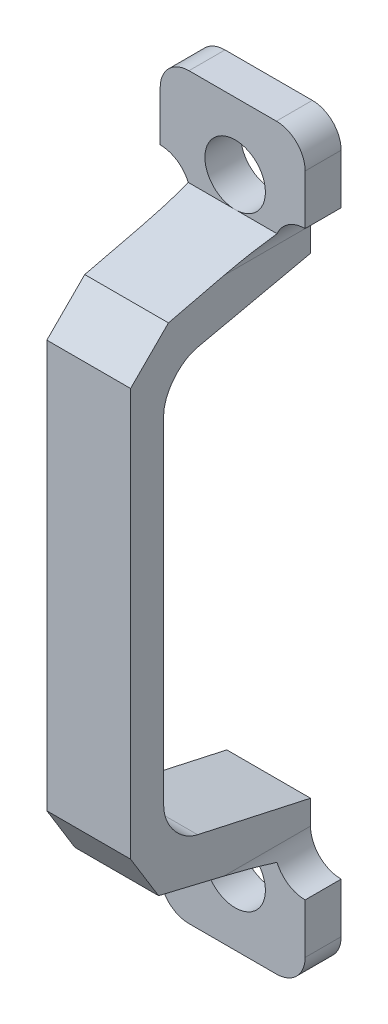
ISO-10303-21;
HEADER;
FILE_DESCRIPTION(('STEP AP214'),'2;1');
FILE_NAME('part.step','',(''),(''),'','','');
FILE_SCHEMA(('AUTOMOTIVE_DESIGN { 1 0 10303 214 1 1 1 1 }'));
ENDSEC;
DATA;
#1=APPLICATION_CONTEXT('core data for automotive mechanical design processes');
#2=APPLICATION_PROTOCOL_DEFINITION('international standard','automotive_design',2000,#1);
#3=PRODUCT_CONTEXT('',#1,'mechanical');
#4=PRODUCT('Part','Part','',(#3));
#5=PRODUCT_RELATED_PRODUCT_CATEGORY('part','',(#4));
#6=PRODUCT_DEFINITION_FORMATION('','',#4);
#7=PRODUCT_DEFINITION_CONTEXT('part definition',#1,'design');
#8=PRODUCT_DEFINITION('design','',#6,#7);
#9=PRODUCT_DEFINITION_SHAPE('','',#8);
#10=(LENGTH_UNIT() NAMED_UNIT(*) SI_UNIT(.MILLI.,.METRE.));
#11=(NAMED_UNIT(*) PLANE_ANGLE_UNIT() SI_UNIT($,.RADIAN.));
#12=(NAMED_UNIT(*) SI_UNIT($,.STERADIAN.) SOLID_ANGLE_UNIT());
#13=UNCERTAINTY_MEASURE_WITH_UNIT(LENGTH_MEASURE(1.E-05),#10,'distance_accuracy_value','');
#14=(GEOMETRIC_REPRESENTATION_CONTEXT(3) GLOBAL_UNCERTAINTY_ASSIGNED_CONTEXT((#13)) GLOBAL_UNIT_ASSIGNED_CONTEXT((#10,
#11,#12)) REPRESENTATION_CONTEXT('',''));
#15=CARTESIAN_POINT('',(0.,0.,0.));
#16=DIRECTION('',(0.,0.,1.));
#17=DIRECTION('',(1.,0.,0.));
#18=AXIS2_PLACEMENT_3D('',#15,#16,#17);
#19=CARTESIAN_POINT('',(89.4859388192383,-29.3519291826514,2.5));
#20=DIRECTION('',(-1.,0.,0.));
#21=DIRECTION('',(0.,0.,1.));
#22=AXIS2_PLACEMENT_3D('',#19,#20,#21);
#23=PLANE('',#22);
#24=DIRECTION('',(0.,1.,0.));
#25=VECTOR('',#24,1.);
#26=CARTESIAN_POINT('',(89.4859388192383,-29.3519291826514,0.));
#27=LINE('',#26,#25);
#28=CARTESIAN_POINT('',(89.4859388192383,-34.8147763907918,0.));
#29=VERTEX_POINT('',#28);
#30=CARTESIAN_POINT('',(89.4859388192383,-31.3519291826514,0.));
#31=VERTEX_POINT('',#30);
#32=EDGE_CURVE('E407',#29,#31,#27,.T.);
#33=ORIENTED_EDGE('',*,*,#32,.T.);
#34=DIRECTION('',(0.,0.,-1.));
#35=VECTOR('',#34,1.);
#36=CARTESIAN_POINT('',(89.4859388192383,-31.3519291826514,2.5));
#37=LINE('',#36,#35);
#38=CARTESIAN_POINT('',(89.4859388192383,-31.3519291826514,2.5));
#39=VERTEX_POINT('',#38);
#40=EDGE_CURVE('E557',#31,#39,#37,.F.);
#41=ORIENTED_EDGE('',*,*,#40,.T.);
#42=DIRECTION('',(0.,1.,0.));
#43=VECTOR('',#42,1.);
#44=CARTESIAN_POINT('',(89.4859388192383,-29.3519291826514,2.5));
#45=LINE('',#44,#43);
#46=CARTESIAN_POINT('',(89.4859388192383,-34.8147763907918,2.5));
#47=VERTEX_POINT('',#46);
#48=EDGE_CURVE('E414',#47,#39,#45,.T.);
#49=ORIENTED_EDGE('',*,*,#48,.F.);
#50=DIRECTION('',(0.,0.,1.));
#51=VECTOR('',#50,1.);
#52=CARTESIAN_POINT('',(89.4859388192383,-34.8147763907918,0.));
#53=LINE('',#52,#51);
#54=EDGE_CURVE('E374',#47,#29,#53,.F.);
#55=ORIENTED_EDGE('',*,*,#54,.T.);
#56=EDGE_LOOP('',(#33,#41,#49,#55));
#57=FACE_BOUND('',#56,.T.);
#58=ADVANCED_FACE('F41',(#57),#23,.F.);
#59=CARTESIAN_POINT('',(79.4177304575605,-29.3519291826514,2.5));
#60=DIRECTION('',(1.,0.,0.));
#61=DIRECTION('',(0.,0.,-1.));
#62=AXIS2_PLACEMENT_3D('',#59,#60,#61);
#63=PLANE('',#62);
#64=DIRECTION('',(0.,-1.,0.));
#65=VECTOR('',#64,1.);
#66=CARTESIAN_POINT('',(79.4177304575605,-29.3519291826514,2.5));
#67=LINE('',#66,#65);
#68=CARTESIAN_POINT('',(79.4177304575605,-31.3519291826514,2.5));
#69=VERTEX_POINT('',#68);
#70=CARTESIAN_POINT('',(79.4177304575605,-34.8147763907918,2.5));
#71=VERTEX_POINT('',#70);
#72=EDGE_CURVE('E418',#69,#71,#67,.T.);
#73=ORIENTED_EDGE('',*,*,#72,.F.);
#74=DIRECTION('',(0.,0.,-1.));
#75=VECTOR('',#74,1.);
#76=CARTESIAN_POINT('',(79.4177304575605,-31.3519291826514,2.5));
#77=LINE('',#76,#75);
#78=CARTESIAN_POINT('',(79.4177304575605,-31.3519291826514,0.));
#79=VERTEX_POINT('',#78);
#80=EDGE_CURVE('E563',#69,#79,#77,.T.);
#81=ORIENTED_EDGE('',*,*,#80,.T.);
#82=DIRECTION('',(0.,-1.,0.));
#83=VECTOR('',#82,1.);
#84=CARTESIAN_POINT('',(79.4177304575605,-29.3519291826514,0.));
#85=LINE('',#84,#83);
#86=CARTESIAN_POINT('',(79.4177304575605,-34.8147763907918,0.));
#87=VERTEX_POINT('',#86);
#88=EDGE_CURVE('E428',#79,#87,#85,.T.);
#89=ORIENTED_EDGE('',*,*,#88,.T.);
#90=DIRECTION('',(0.,0.,1.));
#91=VECTOR('',#90,1.);
#92=CARTESIAN_POINT('',(79.4177304575605,-34.8147763907918,0.));
#93=LINE('',#92,#91);
#94=EDGE_CURVE('E380',#87,#71,#93,.T.);
#95=ORIENTED_EDGE('',*,*,#94,.T.);
#96=EDGE_LOOP('',(#73,#81,#89,#95));
#97=FACE_BOUND('',#96,.T.);
#98=ADVANCED_FACE('F686',(#97),#63,.F.);
#99=CARTESIAN_POINT('',(0.,0.,0.));
#100=DIRECTION('',(0.,0.,1.));
#101=DIRECTION('',(1.,0.,0.));
#102=AXIS2_PLACEMENT_3D('',#99,#100,#101);
#103=PLANE('',#102);
#104=CARTESIAN_POINT('',(84.6238698537211,-34.0071015964445,0.));
#105=DIRECTION('',(0.,0.,1.));
#106=DIRECTION('',(1.,0.,0.));
#107=AXIS2_PLACEMENT_3D('',#104,#105,#106);
#108=CIRCLE('',#107,2.09999999999999);
#109=CARTESIAN_POINT('',(86.723869853721,-34.0071015964445,0.));
#110=VERTEX_POINT('',#109);
#111=EDGE_CURVE('E400',#110,#110,#108,.T.);
#112=ORIENTED_EDGE('',*,*,#111,.T.);
#113=EDGE_LOOP('',(#112));
#114=FACE_BOUND('',#113,.T.);
#115=DIRECTION('',(-1.,0.,0.));
#116=VECTOR('',#115,1.);
#117=CARTESIAN_POINT('',(79.4177304575605,-29.3519291826514,0.));
#118=LINE('',#117,#116);
#119=CARTESIAN_POINT('',(87.4859388192383,-29.3519291826514,0.));
#120=VERTEX_POINT('',#119);
#121=CARTESIAN_POINT('',(81.4177304575605,-29.3519291826514,0.));
#122=VERTEX_POINT('',#121);
#123=EDGE_CURVE('E425',#120,#122,#118,.T.);
#124=ORIENTED_EDGE('',*,*,#123,.F.);
#125=CARTESIAN_POINT('',(87.4859388192383,-31.3519291826514,0.));
#126=DIRECTION('',(0.,0.,1.));
#127=DIRECTION('',(1.,0.,0.));
#128=AXIS2_PLACEMENT_3D('',#125,#126,#127);
#129=CIRCLE('',#128,2.);
#130=EDGE_CURVE('E555',#120,#31,#129,.F.);
#131=ORIENTED_EDGE('',*,*,#130,.T.);
#132=ORIENTED_EDGE('',*,*,#32,.F.);
#133=CARTESIAN_POINT('',(89.4859388192383,-36.9414869075612,0.));
#134=DIRECTION('',(0.,0.,1.));
#135=DIRECTION('',(-1.,0.,0.));
#136=AXIS2_PLACEMENT_3D('',#133,#134,#135);
#137=CIRCLE('',#136,2.12671051676938);
#138=CARTESIAN_POINT('',(87.3592283024689,-36.9414869075612,0.));
#139=VERTEX_POINT('',#138);
#140=EDGE_CURVE('E276',#29,#139,#137,.T.);
#141=ORIENTED_EDGE('',*,*,#140,.T.);
#142=DIRECTION('',(0.,-1.,0.));
#143=VECTOR('',#142,1.);
#144=CARTESIAN_POINT('',(87.3592283024689,-36.9414869075612,0.));
#145=LINE('',#144,#143);
#146=CARTESIAN_POINT('',(87.3592283024689,-38.6188905082452,0.));
#147=VERTEX_POINT('',#146);
#148=EDGE_CURVE('E280',#139,#147,#145,.T.);
#149=ORIENTED_EDGE('',*,*,#148,.T.);
#150=DIRECTION('',(1.,0.,0.));
#151=VECTOR('',#150,1.);
#152=CARTESIAN_POINT('',(79.4177304575605,-38.6188905082452,0.));
#153=LINE('',#152,#151);
#154=CARTESIAN_POINT('',(81.5444409743299,-38.6188905082452,0.));
#155=VERTEX_POINT('',#154);
#156=EDGE_CURVE('E384',#155,#147,#153,.T.);
#157=ORIENTED_EDGE('',*,*,#156,.F.);
#158=DIRECTION('',(0.,1.,0.));
#159=VECTOR('',#158,1.);
#160=CARTESIAN_POINT('',(81.5444409743299,-36.9414869075612,0.));
#161=LINE('',#160,#159);
#162=CARTESIAN_POINT('',(81.5444409743299,-36.9414869075612,0.));
#163=VERTEX_POINT('',#162);
#164=EDGE_CURVE('E258',#155,#163,#161,.T.);
#165=ORIENTED_EDGE('',*,*,#164,.T.);
#166=CARTESIAN_POINT('',(79.4177304575605,-36.9414869075612,0.));
#167=DIRECTION('',(0.,0.,1.));
#168=DIRECTION('',(1.,0.,0.));
#169=AXIS2_PLACEMENT_3D('',#166,#167,#168);
#170=CIRCLE('',#169,2.12671051676938);
#171=EDGE_CURVE('E266',#163,#87,#170,.T.);
#172=ORIENTED_EDGE('',*,*,#171,.T.);
#173=ORIENTED_EDGE('',*,*,#88,.F.);
#174=CARTESIAN_POINT('',(81.4177304575605,-31.3519291826514,0.));
#175=DIRECTION('',(0.,0.,1.));
#176=DIRECTION('',(1.,0.,0.));
#177=AXIS2_PLACEMENT_3D('',#174,#175,#176);
#178=CIRCLE('',#177,2.);
#179=EDGE_CURVE('E553',#79,#122,#178,.F.);
#180=ORIENTED_EDGE('',*,*,#179,.T.);
#181=EDGE_LOOP('',(#124,#131,#132,#141,#149,#157,#165,#172,#173,#180));
#182=FACE_BOUND('',#181,.T.);
#183=ADVANCED_FACE('F692',(#114,#182),#103,.F.);
#184=CARTESIAN_POINT('',(0.,0.,2.5));
#185=DIRECTION('',(0.,0.,1.));
#186=DIRECTION('',(1.,0.,0.));
#187=AXIS2_PLACEMENT_3D('',#184,#185,#186);
#188=PLANE('',#187);
#189=ORIENTED_EDGE('',*,*,#48,.T.);
#190=CARTESIAN_POINT('',(87.4859388192383,-31.3519291826514,2.5));
#191=DIRECTION('',(0.,0.,1.));
#192=DIRECTION('',(1.,0.,0.));
#193=AXIS2_PLACEMENT_3D('',#190,#191,#192);
#194=CIRCLE('',#193,2.);
#195=CARTESIAN_POINT('',(87.4859388192383,-29.3519291826514,2.5));
#196=VERTEX_POINT('',#195);
#197=EDGE_CURVE('E561',#39,#196,#194,.T.);
#198=ORIENTED_EDGE('',*,*,#197,.T.);
#199=DIRECTION('',(-1.,0.,0.));
#200=VECTOR('',#199,1.);
#201=CARTESIAN_POINT('',(79.4177304575605,-29.3519291826514,2.5));
#202=LINE('',#201,#200);
#203=CARTESIAN_POINT('',(81.4177304575605,-29.3519291826514,2.5));
#204=VERTEX_POINT('',#203);
#205=EDGE_CURVE('E413',#196,#204,#202,.T.);
#206=ORIENTED_EDGE('',*,*,#205,.T.);
#207=CARTESIAN_POINT('',(81.4177304575605,-31.3519291826514,2.5));
#208=DIRECTION('',(0.,0.,1.));
#209=DIRECTION('',(1.,0.,0.));
#210=AXIS2_PLACEMENT_3D('',#207,#208,#209);
#211=CIRCLE('',#210,2.);
#212=EDGE_CURVE('E559',#204,#69,#211,.T.);
#213=ORIENTED_EDGE('',*,*,#212,.T.);
#214=ORIENTED_EDGE('',*,*,#72,.T.);
#215=CARTESIAN_POINT('',(79.4177304575605,-36.9414869075612,2.5));
#216=DIRECTION('',(0.,0.,1.));
#217=DIRECTION('',(1.,0.,0.));
#218=AXIS2_PLACEMENT_3D('',#215,#216,#217);
#219=CIRCLE('',#218,2.12671051676938);
#220=CARTESIAN_POINT('',(81.3706141552902,-36.0993806878484,2.5));
#221=VERTEX_POINT('',#220);
#222=EDGE_CURVE('E377',#221,#71,#219,.T.);
#223=ORIENTED_EDGE('',*,*,#222,.F.);
#224=DIRECTION('',(1.,0.,0.));
#225=VECTOR('',#224,1.);
#226=CARTESIAN_POINT('',(40.302418368438,-36.0993806878484,2.5));
#227=LINE('',#226,#225);
#228=CARTESIAN_POINT('',(84.4439581985284,-36.0993806878484,2.5));
#229=VERTEX_POINT('',#228);
#230=EDGE_CURVE('E389',#221,#229,#227,.T.);
#231=ORIENTED_EDGE('',*,*,#230,.T.);
#232=CARTESIAN_POINT('',(84.6238698537211,-34.0071015964445,2.5));
#233=DIRECTION('',(0.,0.,1.));
#234=DIRECTION('',(1.,0.,0.));
#235=AXIS2_PLACEMENT_3D('',#232,#233,#234);
#236=CIRCLE('',#235,2.09999999999999);
#237=CARTESIAN_POINT('',(84.8037815089137,-36.0993806878484,2.5));
#238=VERTEX_POINT('',#237);
#239=EDGE_CURVE('E408',#238,#229,#236,.T.);
#240=ORIENTED_EDGE('',*,*,#239,.F.);
#241=CARTESIAN_POINT('',(87.5330551215085,-36.0993806878484,2.5));
#242=VERTEX_POINT('',#241);
#243=EDGE_CURVE('E393',#238,#242,#227,.T.);
#244=ORIENTED_EDGE('',*,*,#243,.T.);
#245=CARTESIAN_POINT('',(89.4859388192383,-36.9414869075612,2.5));
#246=DIRECTION('',(0.,0.,1.));
#247=DIRECTION('',(1.,0.,0.));
#248=AXIS2_PLACEMENT_3D('',#245,#246,#247);
#249=CIRCLE('',#248,2.12671051676938);
#250=EDGE_CURVE('E372',#47,#242,#249,.T.);
#251=ORIENTED_EDGE('',*,*,#250,.F.);
#252=EDGE_LOOP('',(#189,#198,#206,#213,#214,#223,#231,#240,#244,#251));
#253=FACE_BOUND('',#252,.T.);
#254=ADVANCED_FACE('F744',(#253),#188,.T.);
#255=DIRECTION('',(1.,0.,0.));
#256=VECTOR('',#255,1.);
#257=CARTESIAN_POINT('',(79.4177304575605,-80.6622740102376,2.5));
#258=LINE('',#257,#256);
#259=CARTESIAN_POINT('',(81.4177304575605,-80.6622740102376,2.5));
#260=VERTEX_POINT('',#259);
#261=CARTESIAN_POINT('',(87.4859388192383,-80.6622740102376,2.5));
#262=VERTEX_POINT('',#261);
#263=EDGE_CURVE('E420',#260,#262,#258,.T.);
#264=ORIENTED_EDGE('',*,*,#263,.T.);
#265=CARTESIAN_POINT('',(87.4859388192383,-78.6622740102376,2.5));
#266=DIRECTION('',(0.,0.,1.));
#267=DIRECTION('',(1.,0.,0.));
#268=AXIS2_PLACEMENT_3D('',#265,#266,#267);
#269=CIRCLE('',#268,2.);
#270=CARTESIAN_POINT('',(89.4859388192383,-78.6622740102376,2.5));
#271=VERTEX_POINT('',#270);
#272=EDGE_CURVE('E544',#262,#271,#269,.T.);
#273=ORIENTED_EDGE('',*,*,#272,.T.);
#274=CARTESIAN_POINT('',(89.4859388192383,-75.1994268020973,2.5));
#275=VERTEX_POINT('',#274);
#276=EDGE_CURVE('E411',#271,#275,#45,.T.);
#277=ORIENTED_EDGE('',*,*,#276,.T.);
#278=CARTESIAN_POINT('',(89.4859388192383,-73.0727162853279,2.5));
#279=DIRECTION('',(0.,0.,1.));
#280=DIRECTION('',(1.,0.,0.));
#281=AXIS2_PLACEMENT_3D('',#278,#279,#280);
#282=CIRCLE('',#281,2.12671051676938);
#283=CARTESIAN_POINT('',(87.5330551215086,-73.9148225050407,2.5));
#284=VERTEX_POINT('',#283);
#285=EDGE_CURVE('E362',#284,#275,#282,.T.);
#286=ORIENTED_EDGE('',*,*,#285,.F.);
#287=DIRECTION('',(1.,0.,0.));
#288=VECTOR('',#287,1.);
#289=CARTESIAN_POINT('',(40.302418368438,-73.9148225050407,2.5));
#290=LINE('',#289,#288);
#291=CARTESIAN_POINT('',(84.8037815089143,-73.9148225050407,2.5));
#292=VERTEX_POINT('',#291);
#293=EDGE_CURVE('E396',#292,#284,#290,.T.);
#294=ORIENTED_EDGE('',*,*,#293,.F.);
#295=CARTESIAN_POINT('',(84.6238698537211,-76.0071015964445,2.5));
#296=DIRECTION('',(0.,0.,1.));
#297=DIRECTION('',(1.,0.,0.));
#298=AXIS2_PLACEMENT_3D('',#295,#296,#297);
#299=CIRCLE('',#298,2.1);
#300=CARTESIAN_POINT('',(84.4439581985278,-73.9148225050407,2.5));
#301=VERTEX_POINT('',#300);
#302=EDGE_CURVE('E401',#301,#292,#299,.T.);
#303=ORIENTED_EDGE('',*,*,#302,.F.);
#304=CARTESIAN_POINT('',(81.3706141552902,-73.9148225050407,2.5));
#305=VERTEX_POINT('',#304);
#306=EDGE_CURVE('E394',#305,#301,#290,.T.);
#307=ORIENTED_EDGE('',*,*,#306,.F.);
#308=CARTESIAN_POINT('',(79.4177304575605,-73.0727162853279,2.5));
#309=DIRECTION('',(0.,0.,1.));
#310=DIRECTION('',(1.,0.,0.));
#311=AXIS2_PLACEMENT_3D('',#308,#309,#310);
#312=CIRCLE('',#311,2.12671051676938);
#313=CARTESIAN_POINT('',(79.4177304575605,-75.1994268020973,2.5));
#314=VERTEX_POINT('',#313);
#315=EDGE_CURVE('E368',#314,#305,#312,.T.);
#316=ORIENTED_EDGE('',*,*,#315,.F.);
#317=CARTESIAN_POINT('',(79.4177304575605,-78.6622740102376,2.5));
#318=VERTEX_POINT('',#317);
#319=EDGE_CURVE('E417',#314,#318,#67,.T.);
#320=ORIENTED_EDGE('',*,*,#319,.T.);
#321=CARTESIAN_POINT('',(81.4177304575605,-78.6622740102376,2.5));
#322=DIRECTION('',(0.,0.,1.));
#323=DIRECTION('',(1.,0.,0.));
#324=AXIS2_PLACEMENT_3D('',#321,#322,#323);
#325=CIRCLE('',#324,2.);
#326=EDGE_CURVE('E542',#318,#260,#325,.T.);
#327=ORIENTED_EDGE('',*,*,#326,.T.);
#328=EDGE_LOOP('',(#264,#273,#277,#286,#294,#303,#307,#316,#320,#327));
#329=FACE_BOUND('',#328,.T.);
#330=ADVANCED_FACE('F706',(#329),#188,.T.);
#331=CARTESIAN_POINT('',(89.4859388192383,-78.6622740102376,0.));
#332=VERTEX_POINT('',#331);
#333=CARTESIAN_POINT('',(89.4859388192383,-75.1994268020973,0.));
#334=VERTEX_POINT('',#333);
#335=EDGE_CURVE('E423',#332,#334,#27,.T.);
#336=ORIENTED_EDGE('',*,*,#335,.F.);
#337=CARTESIAN_POINT('',(87.4859388192383,-78.6622740102376,0.));
#338=DIRECTION('',(0.,0.,1.));
#339=DIRECTION('',(1.,0.,0.));
#340=AXIS2_PLACEMENT_3D('',#337,#338,#339);
#341=CIRCLE('',#340,2.);
#342=CARTESIAN_POINT('',(87.4859388192383,-80.6622740102376,0.));
#343=VERTEX_POINT('',#342);
#344=EDGE_CURVE('E535',#332,#343,#341,.F.);
#345=ORIENTED_EDGE('',*,*,#344,.T.);
#346=DIRECTION('',(1.,0.,0.));
#347=VECTOR('',#346,1.);
#348=CARTESIAN_POINT('',(79.4177304575605,-80.6622740102376,0.));
#349=LINE('',#348,#347);
#350=CARTESIAN_POINT('',(81.4177304575605,-80.6622740102376,0.));
#351=VERTEX_POINT('',#350);
#352=EDGE_CURVE('E430',#351,#343,#349,.T.);
#353=ORIENTED_EDGE('',*,*,#352,.F.);
#354=CARTESIAN_POINT('',(81.4177304575605,-78.6622740102376,0.));
#355=DIRECTION('',(0.,0.,1.));
#356=DIRECTION('',(1.,0.,0.));
#357=AXIS2_PLACEMENT_3D('',#354,#355,#356);
#358=CIRCLE('',#357,2.);
#359=CARTESIAN_POINT('',(79.4177304575605,-78.6622740102376,0.));
#360=VERTEX_POINT('',#359);
#361=EDGE_CURVE('E533',#351,#360,#358,.F.);
#362=ORIENTED_EDGE('',*,*,#361,.T.);
#363=CARTESIAN_POINT('',(79.4177304575605,-75.1994268020973,0.));
#364=VERTEX_POINT('',#363);
#365=EDGE_CURVE('E265',#364,#360,#85,.T.);
#366=ORIENTED_EDGE('',*,*,#365,.F.);
#367=CARTESIAN_POINT('',(79.4177304575605,-73.0727162853279,0.));
#368=DIRECTION('',(0.,0.,1.));
#369=DIRECTION('',(1.,0.,0.));
#370=AXIS2_PLACEMENT_3D('',#367,#368,#369);
#371=CIRCLE('',#370,2.12671051676938);
#372=CARTESIAN_POINT('',(81.5444409743299,-73.0727162853279,0.));
#373=VERTEX_POINT('',#372);
#374=EDGE_CURVE('E243',#364,#373,#371,.T.);
#375=ORIENTED_EDGE('',*,*,#374,.T.);
#376=CARTESIAN_POINT('',(81.5444409743299,-71.3953126846439,0.));
#377=VERTEX_POINT('',#376);
#378=EDGE_CURVE('E249',#373,#377,#161,.T.);
#379=ORIENTED_EDGE('',*,*,#378,.T.);
#380=DIRECTION('',(1.,0.,0.));
#381=VECTOR('',#380,1.);
#382=CARTESIAN_POINT('',(79.4177304575605,-71.3953126846439,0.));
#383=LINE('',#382,#381);
#384=CARTESIAN_POINT('',(87.3592283024689,-71.3953126846439,0.));
#385=VERTEX_POINT('',#384);
#386=EDGE_CURVE('E383',#377,#385,#383,.T.);
#387=ORIENTED_EDGE('',*,*,#386,.T.);
#388=CARTESIAN_POINT('',(87.3592283024689,-73.0727162853279,0.));
#389=VERTEX_POINT('',#388);
#390=EDGE_CURVE('E279',#385,#389,#145,.T.);
#391=ORIENTED_EDGE('',*,*,#390,.T.);
#392=CARTESIAN_POINT('',(89.4859388192383,-73.0727162853279,0.));
#393=DIRECTION('',(0.,0.,1.));
#394=DIRECTION('',(-1.,0.,0.));
#395=AXIS2_PLACEMENT_3D('',#392,#393,#394);
#396=CIRCLE('',#395,2.12671051676938);
#397=EDGE_CURVE('E283',#389,#334,#396,.T.);
#398=ORIENTED_EDGE('',*,*,#397,.T.);
#399=EDGE_LOOP('',(#336,#345,#353,#362,#366,#375,#379,#387,#391,#398));
#400=FACE_BOUND('',#399,.T.);
#401=CARTESIAN_POINT('',(84.6238698537211,-76.0071015964445,0.));
#402=DIRECTION('',(0.,0.,1.));
#403=DIRECTION('',(1.,0.,0.));
#404=AXIS2_PLACEMENT_3D('',#401,#402,#403);
#405=CIRCLE('',#404,2.1);
#406=CARTESIAN_POINT('',(86.7238698537211,-76.0071015964445,0.));
#407=VERTEX_POINT('',#406);
#408=EDGE_CURVE('E391',#407,#407,#405,.T.);
#409=ORIENTED_EDGE('',*,*,#408,.T.);
#410=EDGE_LOOP('',(#409));
#411=FACE_BOUND('',#410,.T.);
#412=ADVANCED_FACE('F262',(#400,#411),#103,.F.);
#413=ORIENTED_EDGE('',*,*,#276,.F.);
#414=DIRECTION('',(0.,0.,-1.));
#415=VECTOR('',#414,1.);
#416=CARTESIAN_POINT('',(89.4859388192383,-78.6622740102376,2.5));
#417=LINE('',#416,#415);
#418=EDGE_CURVE('E464',#271,#332,#417,.T.);
#419=ORIENTED_EDGE('',*,*,#418,.T.);
#420=ORIENTED_EDGE('',*,*,#335,.T.);
#421=DIRECTION('',(0.,0.,1.));
#422=VECTOR('',#421,1.);
#423=CARTESIAN_POINT('',(89.4859388192383,-75.1994268020973,0.));
#424=LINE('',#423,#422);
#425=EDGE_CURVE('E365',#334,#275,#424,.T.);
#426=ORIENTED_EDGE('',*,*,#425,.T.);
#427=EDGE_LOOP('',(#413,#419,#420,#426));
#428=FACE_BOUND('',#427,.T.);
#429=ADVANCED_FACE('F688',(#428),#23,.F.);
#430=CARTESIAN_POINT('',(79.4177304575605,-29.3519291826514,2.5));
#431=DIRECTION('',(0.,-1.,0.));
#432=DIRECTION('',(0.,0.,-1.));
#433=AXIS2_PLACEMENT_3D('',#430,#431,#432);
#434=PLANE('',#433);
#435=ORIENTED_EDGE('',*,*,#205,.F.);
#436=DIRECTION('',(0.,0.,-1.));
#437=VECTOR('',#436,1.);
#438=CARTESIAN_POINT('',(87.4859388192383,-29.3519291826514,2.5));
#439=LINE('',#438,#437);
#440=EDGE_CURVE('E550',#196,#120,#439,.T.);
#441=ORIENTED_EDGE('',*,*,#440,.T.);
#442=ORIENTED_EDGE('',*,*,#123,.T.);
#443=DIRECTION('',(0.,0.,-1.));
#444=VECTOR('',#443,1.);
#445=CARTESIAN_POINT('',(81.4177304575605,-29.3519291826514,2.5));
#446=LINE('',#445,#444);
#447=EDGE_CURVE('E548',#122,#204,#446,.F.);
#448=ORIENTED_EDGE('',*,*,#447,.T.);
#449=EDGE_LOOP('',(#435,#441,#442,#448));
#450=FACE_BOUND('',#449,.T.);
#451=ADVANCED_FACE('F699',(#450),#434,.F.);
#452=ORIENTED_EDGE('',*,*,#365,.T.);
#453=DIRECTION('',(0.,0.,-1.));
#454=VECTOR('',#453,1.);
#455=CARTESIAN_POINT('',(79.4177304575605,-78.6622740102376,2.5));
#456=LINE('',#455,#454);
#457=EDGE_CURVE('E546',#360,#318,#456,.F.);
#458=ORIENTED_EDGE('',*,*,#457,.T.);
#459=ORIENTED_EDGE('',*,*,#319,.F.);
#460=DIRECTION('',(0.,0.,1.));
#461=VECTOR('',#460,1.);
#462=CARTESIAN_POINT('',(79.4177304575605,-75.1994268020973,0.));
#463=LINE('',#462,#461);
#464=EDGE_CURVE('E370',#314,#364,#463,.F.);
#465=ORIENTED_EDGE('',*,*,#464,.T.);
#466=EDGE_LOOP('',(#452,#458,#459,#465));
#467=FACE_BOUND('',#466,.T.);
#468=ADVANCED_FACE('F695',(#467),#63,.F.);
#469=CARTESIAN_POINT('',(79.4177304575605,-80.6622740102376,2.5));
#470=DIRECTION('',(0.,1.,0.));
#471=DIRECTION('',(0.,0.,1.));
#472=AXIS2_PLACEMENT_3D('',#469,#470,#471);
#473=PLANE('',#472);
#474=ORIENTED_EDGE('',*,*,#352,.T.);
#475=DIRECTION('',(0.,0.,-1.));
#476=VECTOR('',#475,1.);
#477=CARTESIAN_POINT('',(87.4859388192383,-80.6622740102376,2.5));
#478=LINE('',#477,#476);
#479=EDGE_CURVE('E540',#343,#262,#478,.F.);
#480=ORIENTED_EDGE('',*,*,#479,.T.);
#481=ORIENTED_EDGE('',*,*,#263,.F.);
#482=DIRECTION('',(0.,0.,-1.));
#483=VECTOR('',#482,1.);
#484=CARTESIAN_POINT('',(81.4177304575605,-80.6622740102376,2.5));
#485=LINE('',#484,#483);
#486=EDGE_CURVE('E537',#260,#351,#485,.T.);
#487=ORIENTED_EDGE('',*,*,#486,.T.);
#488=EDGE_LOOP('',(#474,#480,#481,#487));
#489=FACE_BOUND('',#488,.T.);
#490=ADVANCED_FACE('F718',(#489),#473,.F.);
#491=CARTESIAN_POINT('',(84.6238698537211,-34.0071015964445,2.5));
#492=DIRECTION('',(0.,0.,-1.));
#493=DIRECTION('',(-1.,0.,0.));
#494=AXIS2_PLACEMENT_3D('',#491,#492,#493);
#495=CYLINDRICAL_SURFACE('',#494,2.09999999999999);
#496=EDGE_CURVE('E404',#229,#238,#236,.T.);
#497=ORIENTED_EDGE('',*,*,#496,.T.);
#498=ORIENTED_EDGE('',*,*,#239,.T.);
#499=EDGE_LOOP('',(#497,#498));
#500=FACE_BOUND('',#499,.T.);
#501=ORIENTED_EDGE('',*,*,#111,.F.);
#502=EDGE_LOOP('',(#501));
#503=FACE_BOUND('',#502,.T.);
#504=ADVANCED_FACE('F775',(#500,#503),#495,.F.);
#505=CARTESIAN_POINT('',(84.6238698537211,-76.0071015964445,2.5));
#506=DIRECTION('',(0.,0.,-1.));
#507=DIRECTION('',(-1.,0.,0.));
#508=AXIS2_PLACEMENT_3D('',#505,#506,#507);
#509=CYLINDRICAL_SURFACE('',#508,2.1);
#510=EDGE_CURVE('E397',#292,#301,#299,.T.);
#511=ORIENTED_EDGE('',*,*,#510,.T.);
#512=ORIENTED_EDGE('',*,*,#302,.T.);
#513=EDGE_LOOP('',(#511,#512));
#514=FACE_BOUND('',#513,.T.);
#515=ORIENTED_EDGE('',*,*,#408,.F.);
#516=EDGE_LOOP('',(#515));
#517=FACE_BOUND('',#516,.T.);
#518=ADVANCED_FACE('F758',(#514,#517),#509,.F.);
#519=CARTESIAN_POINT('',(40.302418368438,-73.9148225050407,2.5));
#520=DIRECTION('',(0.,0.,-1.));
#521=DIRECTION('',(-1.,0.,0.));
#522=AXIS2_PLACEMENT_3D('',#519,#520,#521);
#523=PLANE('',#522);
#524=ORIENTED_EDGE('',*,*,#496,.F.);
#525=EDGE_CURVE('E392',#229,#238,#227,.T.);
#526=ORIENTED_EDGE('',*,*,#525,.T.);
#527=EDGE_LOOP('',(#524,#526));
#528=FACE_BOUND('',#527,.T.);
#529=ADVANCED_FACE('F763',(#528),#523,.T.);
#530=ORIENTED_EDGE('',*,*,#510,.F.);
#531=EDGE_CURVE('E387',#301,#292,#290,.T.);
#532=ORIENTED_EDGE('',*,*,#531,.F.);
#533=EDGE_LOOP('',(#530,#532));
#534=FACE_BOUND('',#533,.T.);
#535=ADVANCED_FACE('F761',(#534),#523,.T.);
#536=CARTESIAN_POINT('',(40.302418368438,-38.4970321387793,12.5));
#537=DIRECTION('',(0.,0.,1.));
#538=DIRECTION('',(0.,-1.,0.));
#539=AXIS2_PLACEMENT_3D('',#536,#537,#538);
#540=PLANE('',#539);
#541=DIRECTION('',(0.,-1.,0.));
#542=VECTOR('',#541,1.);
#543=CARTESIAN_POINT('',(87.3592283024689,-38.4970321387793,12.5));
#544=LINE('',#543,#542);
#545=CARTESIAN_POINT('',(87.3592283024689,-40.4970321387793,12.5));
#546=VERTEX_POINT('',#545);
#547=CARTESIAN_POINT('',(87.3592283024689,-68.8118438239469,12.5));
#548=VERTEX_POINT('',#547);
#549=EDGE_CURVE('E592',#546,#548,#544,.T.);
#550=ORIENTED_EDGE('',*,*,#549,.F.);
#551=DIRECTION('',(-1.,0.,0.));
#552=VECTOR('',#551,1.);
#553=CARTESIAN_POINT('',(40.302418368438,-40.4970321387793,12.5));
#554=LINE('',#553,#552);
#555=CARTESIAN_POINT('',(81.5444409743299,-40.4970321387793,12.5));
#556=VERTEX_POINT('',#555);
#557=EDGE_CURVE('E62',#546,#556,#554,.T.);
#558=ORIENTED_EDGE('',*,*,#557,.T.);
#559=DIRECTION('',(0.,1.,0.));
#560=VECTOR('',#559,1.);
#561=CARTESIAN_POINT('',(81.5444409743299,-38.4970321387793,12.5));
#562=LINE('',#561,#560);
#563=CARTESIAN_POINT('',(81.5444409743299,-68.8118438239469,12.5));
#564=VERTEX_POINT('',#563);
#565=EDGE_CURVE('E358',#564,#556,#562,.T.);
#566=ORIENTED_EDGE('',*,*,#565,.F.);
#567=DIRECTION('',(1.,0.,0.));
#568=VECTOR('',#567,1.);
#569=CARTESIAN_POINT('',(40.302418368438,-68.8118438239469,12.5));
#570=LINE('',#569,#568);
#571=EDGE_CURVE('E573',#564,#548,#570,.T.);
#572=ORIENTED_EDGE('',*,*,#571,.T.);
#573=EDGE_LOOP('',(#550,#558,#566,#572));
#574=FACE_BOUND('',#573,.T.);
#575=ADVANCED_FACE('F594',(#574),#540,.T.);
#576=CARTESIAN_POINT('',(40.302418368438,-36.0993806878484,2.5));
#577=DIRECTION('',(0.,0.972439104499251,0.23315700298446));
#578=DIRECTION('',(0.,-0.23315700298446,0.972439104499251));
#579=AXIS2_PLACEMENT_3D('',#576,#577,#578);
#580=PLANE('',#579);
#581=DIRECTION('',(0.,0.23315700298446,-0.972439104499251));
#582=VECTOR('',#581,1.);
#583=CARTESIAN_POINT('',(81.5444409743299,-36.0993806878484,2.5));
#584=LINE('',#583,#582);
#585=CARTESIAN_POINT('',(81.5444409743299,-37.8662661497023,9.86923401092299));
#586=VERTEX_POINT('',#585);
#587=CARTESIAN_POINT('',(81.5444409743299,-36.9414869075612,6.01221283387893));
#588=VERTEX_POINT('',#587);
#589=EDGE_CURVE('E360',#586,#588,#584,.T.);
#590=ORIENTED_EDGE('',*,*,#589,.F.);
#591=DIRECTION('',(1.,0.,0.));
#592=VECTOR('',#591,1.);
#593=CARTESIAN_POINT('',(40.302418368438,-37.8662661497023,9.86923401092299));
#594=LINE('',#593,#592);
#595=CARTESIAN_POINT('',(87.3592283024689,-37.8662661497023,9.86923401092299));
#596=VERTEX_POINT('',#595);
#597=EDGE_CURVE('E566',#586,#596,#594,.T.);
#598=ORIENTED_EDGE('',*,*,#597,.T.);
#599=DIRECTION('',(0.,-0.23315700298446,0.972439104499251));
#600=VECTOR('',#599,1.);
#601=CARTESIAN_POINT('',(87.3592283024689,-36.0993806878484,2.5));
#602=LINE('',#601,#600);
#603=CARTESIAN_POINT('',(87.3592283024689,-36.9414869075612,6.01221283387893));
#604=VERTEX_POINT('',#603);
#605=EDGE_CURVE('E593',#604,#596,#602,.T.);
#606=ORIENTED_EDGE('',*,*,#605,.F.);
#607=CARTESIAN_POINT('',(89.4859388192383,-36.9414869075612,6.01221283387894));
#608=DIRECTION('',(0.,0.972439104499251,0.23315700298446));
#609=DIRECTION('',(0.,-0.23315700298446,0.972439104499251));
#610=AXIS2_PLACEMENT_3D('',#607,#608,#609);
#611=ELLIPSE('',#610,9.1213666737307,2.12671051676938);
#612=EDGE_CURVE('E736',#242,#604,#611,.T.);
#613=ORIENTED_EDGE('',*,*,#612,.F.);
#614=ORIENTED_EDGE('',*,*,#243,.F.);
#615=ORIENTED_EDGE('',*,*,#525,.F.);
#616=ORIENTED_EDGE('',*,*,#230,.F.);
#617=CARTESIAN_POINT('',(79.4177304575605,-36.9414869075612,6.01221283387894));
#618=DIRECTION('',(0.,0.972439104499251,0.23315700298446));
#619=DIRECTION('',(0.,-0.23315700298446,0.972439104499251));
#620=AXIS2_PLACEMENT_3D('',#617,#618,#619);
#621=ELLIPSE('',#620,9.1213666737307,2.12671051676938);
#622=EDGE_CURVE('E453',#588,#221,#621,.T.);
#623=ORIENTED_EDGE('',*,*,#622,.F.);
#624=EDGE_LOOP('',(#590,#598,#606,#613,#614,#615,#616,#623));
#625=FACE_BOUND('',#624,.T.);
#626=ADVANCED_FACE('F584',(#625),#580,.T.);
#627=CARTESIAN_POINT('',(40.302418368438,-71.5171710541098,12.5));
#628=DIRECTION('',(0.,-0.972439104499251,0.23315700298446));
#629=DIRECTION('',(0.,-0.23315700298446,-0.972439104499251));
#630=AXIS2_PLACEMENT_3D('',#627,#628,#629);
#631=PLANE('',#630);
#632=DIRECTION('',(0.,-0.23315700298446,-0.972439104499251));
#633=VECTOR('',#632,1.);
#634=CARTESIAN_POINT('',(87.3592283024689,-71.5171710541098,12.5));
#635=LINE('',#634,#633);
#636=CARTESIAN_POINT('',(87.3592283024689,-71.9834850600787,10.5551217910015));
#637=VERTEX_POINT('',#636);
#638=CARTESIAN_POINT('',(87.3592283024689,-73.0727162853279,6.01221283387896));
#639=VERTEX_POINT('',#638);
#640=EDGE_CURVE('E596',#637,#639,#635,.T.);
#641=ORIENTED_EDGE('',*,*,#640,.F.);
#642=DIRECTION('',(-1.,0.,0.));
#643=VECTOR('',#642,1.);
#644=CARTESIAN_POINT('',(40.302418368438,-71.9834850600787,10.5551217910015));
#645=LINE('',#644,#643);
#646=CARTESIAN_POINT('',(81.5444409743299,-71.9834850600787,10.5551217910015));
#647=VERTEX_POINT('',#646);
#648=EDGE_CURVE('E12',#637,#647,#645,.T.);
#649=ORIENTED_EDGE('',*,*,#648,.T.);
#650=DIRECTION('',(0.,0.23315700298446,0.972439104499251));
#651=VECTOR('',#650,1.);
#652=CARTESIAN_POINT('',(81.5444409743299,-71.5171710541098,12.5));
#653=LINE('',#652,#651);
#654=CARTESIAN_POINT('',(81.5444409743299,-73.0727162853279,6.01221283387896));
#655=VERTEX_POINT('',#654);
#656=EDGE_CURVE('E351',#655,#647,#653,.T.);
#657=ORIENTED_EDGE('',*,*,#656,.F.);
#658=CARTESIAN_POINT('',(79.4177304575605,-73.0727162853279,6.01221283387896));
#659=DIRECTION('',(0.,-0.972439104499251,0.23315700298446));
#660=DIRECTION('',(0.,0.23315700298446,0.972439104499251));
#661=AXIS2_PLACEMENT_3D('',#658,#659,#660);
#662=ELLIPSE('',#661,9.12136667373067,2.12671051676938);
#663=EDGE_CURVE('E246',#305,#655,#662,.T.);
#664=ORIENTED_EDGE('',*,*,#663,.F.);
#665=ORIENTED_EDGE('',*,*,#306,.T.);
#666=ORIENTED_EDGE('',*,*,#531,.T.);
#667=ORIENTED_EDGE('',*,*,#293,.T.);
#668=CARTESIAN_POINT('',(89.4859388192383,-73.0727162853279,6.01221283387896));
#669=DIRECTION('',(0.,-0.972439104499251,0.23315700298446));
#670=DIRECTION('',(0.,0.23315700298446,0.972439104499251));
#671=AXIS2_PLACEMENT_3D('',#668,#669,#670);
#672=ELLIPSE('',#671,9.12136667373067,2.12671051676938);
#673=EDGE_CURVE('E460',#639,#284,#672,.T.);
#674=ORIENTED_EDGE('',*,*,#673,.F.);
#675=EDGE_LOOP('',(#641,#649,#657,#664,#665,#666,#667,#674));
#676=FACE_BOUND('',#675,.T.);
#677=ADVANCED_FACE('F733',(#676),#631,.T.);
#678=CARTESIAN_POINT('',(79.4177304575605,-38.6188905082452,0.));
#679=DIRECTION('',(0.,0.976633494112856,0.214911652026859));
#680=DIRECTION('',(0.,-0.214911652026859,0.976633494112856));
#681=AXIS2_PLACEMENT_3D('',#678,#679,#680);
#682=PLANE('',#681);
#683=DIRECTION('',(0.,-0.214911652026859,0.976633494112856));
#684=VECTOR('',#683,1.);
#685=CARTESIAN_POINT('',(87.3592283024689,-38.6188905082452,0.));
#686=LINE('',#685,#684);
#687=CARTESIAN_POINT('',(87.3592283024689,-40.3448851014713,7.84352134704958));
#688=VERTEX_POINT('',#687);
#689=EDGE_CURVE('E298',#147,#688,#686,.T.);
#690=ORIENTED_EDGE('',*,*,#689,.T.);
#691=CARTESIAN_POINT('',(81.2537016079229,-40.3448851014713,7.84352134704958));
#692=CARTESIAN_POINT('',(83.3857902949073,-40.3448851014713,7.84352134704958));
#693=CARTESIAN_POINT('',(85.5178789818915,-40.3448851014713,7.84352134704958));
#694=CARTESIAN_POINT('',(87.6499676688758,-40.3448851014713,7.84352134704958));
#695=(BOUNDED_CURVE() B_SPLINE_CURVE(3,(#691,#692,#693,#694),.UNSPECIFIED.,.F.,
.F.) B_SPLINE_CURVE_WITH_KNOTS((4,4),(-0.00823223721131533,-0.00183597115036243),
.UNSPECIFIED.) CURVE() GEOMETRIC_REPRESENTATION_ITEM() RATIONAL_B_SPLINE_CURVE((1.,1.,1.,1.)) REPRESENTATION_ITEM(''));
#696=CARTESIAN_POINT('',(81.5444409743299,-40.3448851014713,7.84352134704958));
#697=VERTEX_POINT('',#696);
#698=EDGE_CURVE('E601',#688,#697,#695,.F.);
#699=ORIENTED_EDGE('',*,*,#698,.T.);
#700=DIRECTION('',(0.,0.214911652026859,-0.976633494112856));
#701=VECTOR('',#700,1.);
#702=CARTESIAN_POINT('',(81.5444409743299,-38.6188905082452,0.));
#703=LINE('',#702,#701);
#704=EDGE_CURVE('E343',#697,#155,#703,.T.);
#705=ORIENTED_EDGE('',*,*,#704,.T.);
#706=ORIENTED_EDGE('',*,*,#156,.T.);
#707=EDGE_LOOP('',(#690,#699,#705,#706));
#708=FACE_BOUND('',#707,.T.);
#709=ADVANCED_FACE('F323',(#708),#682,.F.);
#710=CARTESIAN_POINT('',(79.4177304575605,-69.151033694455,10.198786390969));
#711=DIRECTION('',(0.,-0.976633494112856,0.21491165202686));
#712=DIRECTION('',(0.,-0.21491165202686,-0.976633494112856));
#713=AXIS2_PLACEMENT_3D('',#710,#711,#712);
#714=PLANE('',#713);
#715=DIRECTION('',(0.,0.21491165202686,0.976633494112856));
#716=VECTOR('',#715,1.);
#717=CARTESIAN_POINT('',(81.5444409743299,-69.151033694455,10.198786390969));
#718=LINE('',#717,#716);
#719=CARTESIAN_POINT('',(81.5444409743299,-69.6693180914177,7.84352134704959));
#720=VERTEX_POINT('',#719);
#721=EDGE_CURVE('E254',#377,#720,#718,.T.);
#722=ORIENTED_EDGE('',*,*,#721,.T.);
#723=CARTESIAN_POINT('',(87.6499676688758,-69.6693180914177,7.84352134704958));
#724=CARTESIAN_POINT('',(85.5178789818915,-69.6693180914177,7.84352134704958));
#725=CARTESIAN_POINT('',(83.3857902949073,-69.6693180914177,7.84352134704958));
#726=CARTESIAN_POINT('',(81.2537016079229,-69.6693180914177,7.84352134704958));
#727=(BOUNDED_CURVE() B_SPLINE_CURVE(3,(#723,#724,#725,#726),.UNSPECIFIED.,.F.,
.F.) B_SPLINE_CURVE_WITH_KNOTS((4,4),(-0.00823223721131533,-0.00183597115036243),
.UNSPECIFIED.) CURVE() GEOMETRIC_REPRESENTATION_ITEM() RATIONAL_B_SPLINE_CURVE((1.,1.,1.,1.)) REPRESENTATION_ITEM(''));
#728=CARTESIAN_POINT('',(87.3592283024689,-69.6693180914177,7.84352134704958));
#729=VERTEX_POINT('',#728);
#730=EDGE_CURVE('E305',#720,#729,#727,.F.);
#731=ORIENTED_EDGE('',*,*,#730,.T.);
#732=DIRECTION('',(0.,-0.21491165202686,-0.976633494112856));
#733=VECTOR('',#732,1.);
#734=CARTESIAN_POINT('',(87.3592283024689,-69.151033694455,10.198786390969));
#735=LINE('',#734,#733);
#736=EDGE_CURVE('E275',#729,#385,#735,.T.);
#737=ORIENTED_EDGE('',*,*,#736,.T.);
#738=ORIENTED_EDGE('',*,*,#386,.F.);
#739=EDGE_LOOP('',(#722,#731,#737,#738));
#740=FACE_BOUND('',#739,.T.);
#741=ADVANCED_FACE('F312',(#740),#714,.F.);
#742=CARTESIAN_POINT('',(79.4177304575605,-40.863169498434,10.198786390969));
#743=DIRECTION('',(0.,0.,1.));
#744=DIRECTION('',(1.,0.,0.));
#745=AXIS2_PLACEMENT_3D('',#742,#743,#744);
#746=PLANE('',#745);
#747=DIRECTION('',(0.,1.,0.));
#748=VECTOR('',#747,1.);
#749=CARTESIAN_POINT('',(81.5444409743299,-40.863169498434,10.198786390969));
#750=LINE('',#749,#748);
#751=CARTESIAN_POINT('',(81.5444409743299,-66.7394176090791,10.198786390969));
#752=VERTEX_POINT('',#751);
#753=CARTESIAN_POINT('',(81.5444409743299,-43.2747855838099,10.198786390969));
#754=VERTEX_POINT('',#753);
#755=EDGE_CURVE('E441',#752,#754,#750,.T.);
#756=ORIENTED_EDGE('',*,*,#755,.T.);
#757=CARTESIAN_POINT('',(87.6499676688758,-43.2747855838099,10.198786390969));
#758=CARTESIAN_POINT('',(85.5178789818915,-43.2747855838099,10.198786390969));
#759=CARTESIAN_POINT('',(83.3857902949073,-43.2747855838099,10.198786390969));
#760=CARTESIAN_POINT('',(81.2537016079229,-43.2747855838099,10.198786390969));
#761=(BOUNDED_CURVE() B_SPLINE_CURVE(3,(#757,#758,#759,#760),.UNSPECIFIED.,.F.,
.F.) B_SPLINE_CURVE_WITH_KNOTS((4,4),(-0.00823223721131533,-0.00183597115036243),
.UNSPECIFIED.) CURVE() GEOMETRIC_REPRESENTATION_ITEM() RATIONAL_B_SPLINE_CURVE((1.,1.,1.,1.)) REPRESENTATION_ITEM(''));
#762=CARTESIAN_POINT('',(87.3592283024689,-43.2747855838099,10.198786390969));
#763=VERTEX_POINT('',#762);
#764=EDGE_CURVE('E452',#754,#763,#761,.F.);
#765=ORIENTED_EDGE('',*,*,#764,.T.);
#766=DIRECTION('',(0.,-1.,0.));
#767=VECTOR('',#766,1.);
#768=CARTESIAN_POINT('',(87.3592283024689,-40.863169498434,10.198786390969));
#769=LINE('',#768,#767);
#770=CARTESIAN_POINT('',(87.3592283024689,-66.7394176090792,10.198786390969));
#771=VERTEX_POINT('',#770);
#772=EDGE_CURVE('E438',#763,#771,#769,.T.);
#773=ORIENTED_EDGE('',*,*,#772,.T.);
#774=CARTESIAN_POINT('',(81.2537016079229,-66.7394176090791,10.198786390969));
#775=CARTESIAN_POINT('',(83.3857902949073,-66.7394176090791,10.198786390969));
#776=CARTESIAN_POINT('',(85.5178789818915,-66.7394176090791,10.198786390969));
#777=CARTESIAN_POINT('',(87.6499676688758,-66.7394176090791,10.198786390969));
#778=(BOUNDED_CURVE() B_SPLINE_CURVE(3,(#774,#775,#776,#777),.UNSPECIFIED.,.F.,
.F.) B_SPLINE_CURVE_WITH_KNOTS((4,4),(-0.00823223721131533,-0.00183597115036243),
.UNSPECIFIED.) CURVE() GEOMETRIC_REPRESENTATION_ITEM() RATIONAL_B_SPLINE_CURVE((1.,1.,1.,1.)) REPRESENTATION_ITEM(''));
#779=EDGE_CURVE('E445',#771,#752,#778,.F.);
#780=ORIENTED_EDGE('',*,*,#779,.T.);
#781=EDGE_LOOP('',(#756,#765,#773,#780));
#782=FACE_BOUND('',#781,.T.);
#783=ADVANCED_FACE('F322',(#782),#746,.F.);
#784=CARTESIAN_POINT('',(89.4859388192383,-36.9414869075612,0.));
#785=DIRECTION('',(0.,0.,1.));
#786=DIRECTION('',(1.,0.,0.));
#787=AXIS2_PLACEMENT_3D('',#784,#785,#786);
#788=CYLINDRICAL_SURFACE('',#787,2.12671051676938);
#789=ORIENTED_EDGE('',*,*,#250,.T.);
#790=ORIENTED_EDGE('',*,*,#612,.T.);
#791=DIRECTION('',(0.,0.,1.));
#792=VECTOR('',#791,1.);
#793=CARTESIAN_POINT('',(87.3592283024689,-36.9414869075612,0.));
#794=LINE('',#793,#792);
#795=EDGE_CURVE('E286',#139,#604,#794,.T.);
#796=ORIENTED_EDGE('',*,*,#795,.F.);
#797=ORIENTED_EDGE('',*,*,#140,.F.);
#798=ORIENTED_EDGE('',*,*,#54,.F.);
#799=EDGE_LOOP('',(#789,#790,#796,#797,#798));
#800=FACE_BOUND('',#799,.T.);
#801=ADVANCED_FACE('F324',(#800),#788,.F.);
#802=CARTESIAN_POINT('',(89.4859388192383,-73.0727162853279,0.));
#803=DIRECTION('',(0.,0.,1.));
#804=DIRECTION('',(1.,0.,0.));
#805=AXIS2_PLACEMENT_3D('',#802,#803,#804);
#806=CYLINDRICAL_SURFACE('',#805,2.12671051676938);
#807=ORIENTED_EDGE('',*,*,#397,.F.);
#808=DIRECTION('',(0.,0.,1.));
#809=VECTOR('',#808,1.);
#810=CARTESIAN_POINT('',(87.3592283024689,-73.0727162853279,0.));
#811=LINE('',#810,#809);
#812=EDGE_CURVE('E270',#389,#639,#811,.T.);
#813=ORIENTED_EDGE('',*,*,#812,.T.);
#814=ORIENTED_EDGE('',*,*,#673,.T.);
#815=ORIENTED_EDGE('',*,*,#285,.T.);
#816=ORIENTED_EDGE('',*,*,#425,.F.);
#817=EDGE_LOOP('',(#807,#813,#814,#815,#816));
#818=FACE_BOUND('',#817,.T.);
#819=ADVANCED_FACE('F639',(#818),#806,.F.);
#820=CARTESIAN_POINT('',(87.3592283024689,-36.9414869075612,0.));
#821=DIRECTION('',(-1.,0.,0.));
#822=DIRECTION('',(0.,0.,1.));
#823=AXIS2_PLACEMENT_3D('',#820,#821,#822);
#824=PLANE('',#823);
#825=ORIENTED_EDGE('',*,*,#605,.T.);
#826=DIRECTION('',(0.,0.707106781186548,-0.707106781186547));
#827=VECTOR('',#826,1.);
#828=CARTESIAN_POINT('',(87.3592283024689,-37.8662661497023,9.86923401092299));
#829=LINE('',#828,#827);
#830=EDGE_CURVE('E571',#596,#546,#829,.F.);
#831=ORIENTED_EDGE('',*,*,#830,.T.);
#832=ORIENTED_EDGE('',*,*,#549,.T.);
#833=DIRECTION('',(0.,0.852485182973837,0.522751387190951));
#834=VECTOR('',#833,1.);
#835=CARTESIAN_POINT('',(87.3592283024689,-68.8118438239469,12.5));
#836=LINE('',#835,#834);
#837=EDGE_CURVE('E569',#548,#637,#836,.F.);
#838=ORIENTED_EDGE('',*,*,#837,.T.);
#839=ORIENTED_EDGE('',*,*,#640,.T.);
#840=ORIENTED_EDGE('',*,*,#812,.F.);
#841=ORIENTED_EDGE('',*,*,#390,.F.);
#842=ORIENTED_EDGE('',*,*,#736,.F.);
#843=CARTESIAN_POINT('',(87.3592283024689,-66.7394176090791,10.198786390969));
#844=CARTESIAN_POINT('',(87.3592283024689,-69.151033694455,10.198786390969));
#845=CARTESIAN_POINT('',(87.3592283024689,-69.6693180914177,7.84352134704958));
#846=(BOUNDED_CURVE() B_SPLINE_CURVE(2,(#843,#844,#845),.UNSPECIFIED.,.F.,
.F.) B_SPLINE_CURVE_WITH_KNOTS((3,3),(0.,1.),
.UNSPECIFIED.) CURVE() GEOMETRIC_REPRESENTATION_ITEM() RATIONAL_B_SPLINE_CURVE((1.,
0.666666666666667,1.)) REPRESENTATION_ITEM(''));
#847=EDGE_CURVE('E465',#729,#771,#846,.F.);
#848=ORIENTED_EDGE('',*,*,#847,.T.);
#849=ORIENTED_EDGE('',*,*,#772,.F.);
#850=CARTESIAN_POINT('',(87.3592283024689,-40.3448851014713,7.84352134704958));
#851=CARTESIAN_POINT('',(87.3592283024689,-40.863169498434,10.198786390969));
#852=CARTESIAN_POINT('',(87.3592283024689,-43.2747855838099,10.198786390969));
#853=(BOUNDED_CURVE() B_SPLINE_CURVE(2,(#850,#851,#852),.UNSPECIFIED.,.F.,
.F.) B_SPLINE_CURVE_WITH_KNOTS((3,3),(0.,1.),
.UNSPECIFIED.) CURVE() GEOMETRIC_REPRESENTATION_ITEM() RATIONAL_B_SPLINE_CURVE((1.,
0.666666666666667,1.)) REPRESENTATION_ITEM(''));
#854=EDGE_CURVE('E606',#763,#688,#853,.F.);
#855=ORIENTED_EDGE('',*,*,#854,.T.);
#856=ORIENTED_EDGE('',*,*,#689,.F.);
#857=ORIENTED_EDGE('',*,*,#148,.F.);
#858=ORIENTED_EDGE('',*,*,#795,.T.);
#859=EDGE_LOOP('',(#825,#831,#832,#838,#839,#840,#841,#842,#848,#849,#855,#856,#857,#858));
#860=FACE_BOUND('',#859,.T.);
#861=ADVANCED_FACE('F591',(#860),#824,.F.);
#862=CARTESIAN_POINT('',(79.4177304575605,-36.9414869075612,0.));
#863=DIRECTION('',(0.,0.,1.));
#864=DIRECTION('',(1.,0.,0.));
#865=AXIS2_PLACEMENT_3D('',#862,#863,#864);
#866=CYLINDRICAL_SURFACE('',#865,2.12671051676938);
#867=ORIENTED_EDGE('',*,*,#171,.F.);
#868=DIRECTION('',(0.,0.,1.));
#869=VECTOR('',#868,1.);
#870=CARTESIAN_POINT('',(81.5444409743299,-36.9414869075612,0.));
#871=LINE('',#870,#869);
#872=EDGE_CURVE('E248',#163,#588,#871,.T.);
#873=ORIENTED_EDGE('',*,*,#872,.T.);
#874=ORIENTED_EDGE('',*,*,#622,.T.);
#875=ORIENTED_EDGE('',*,*,#222,.T.);
#876=ORIENTED_EDGE('',*,*,#94,.F.);
#877=EDGE_LOOP('',(#867,#873,#874,#875,#876));
#878=FACE_BOUND('',#877,.T.);
#879=ADVANCED_FACE('F638',(#878),#866,.F.);
#880=CARTESIAN_POINT('',(79.4177304575605,-73.0727162853279,0.));
#881=DIRECTION('',(0.,0.,1.));
#882=DIRECTION('',(1.,0.,0.));
#883=AXIS2_PLACEMENT_3D('',#880,#881,#882);
#884=CYLINDRICAL_SURFACE('',#883,2.12671051676938);
#885=ORIENTED_EDGE('',*,*,#315,.T.);
#886=ORIENTED_EDGE('',*,*,#663,.T.);
#887=DIRECTION('',(0.,0.,1.));
#888=VECTOR('',#887,1.);
#889=CARTESIAN_POINT('',(81.5444409743299,-73.0727162853279,0.));
#890=LINE('',#889,#888);
#891=EDGE_CURVE('E239',#373,#655,#890,.T.);
#892=ORIENTED_EDGE('',*,*,#891,.F.);
#893=ORIENTED_EDGE('',*,*,#374,.F.);
#894=ORIENTED_EDGE('',*,*,#464,.F.);
#895=EDGE_LOOP('',(#885,#886,#892,#893,#894));
#896=FACE_BOUND('',#895,.T.);
#897=ADVANCED_FACE('F241',(#896),#884,.F.);
#898=CARTESIAN_POINT('',(81.5444409743299,-36.9414869075612,0.));
#899=DIRECTION('',(1.,0.,0.));
#900=DIRECTION('',(0.,0.,-1.));
#901=AXIS2_PLACEMENT_3D('',#898,#899,#900);
#902=PLANE('',#901);
#903=ORIENTED_EDGE('',*,*,#565,.T.);
#904=DIRECTION('',(0.,-0.707106781186548,0.707106781186547));
#905=VECTOR('',#904,1.);
#906=CARTESIAN_POINT('',(81.5444409743299,-37.8662661497023,9.86923401092299));
#907=LINE('',#906,#905);
#908=EDGE_CURVE('E49',#556,#586,#907,.F.);
#909=ORIENTED_EDGE('',*,*,#908,.T.);
#910=ORIENTED_EDGE('',*,*,#589,.T.);
#911=ORIENTED_EDGE('',*,*,#872,.F.);
#912=ORIENTED_EDGE('',*,*,#164,.F.);
#913=ORIENTED_EDGE('',*,*,#704,.F.);
#914=CARTESIAN_POINT('',(81.5444409743299,-43.2747855838099,10.198786390969));
#915=CARTESIAN_POINT('',(81.5444409743299,-40.863169498434,10.198786390969));
#916=CARTESIAN_POINT('',(81.5444409743299,-40.3448851014713,7.84352134704958));
#917=(BOUNDED_CURVE() B_SPLINE_CURVE(2,(#914,#915,#916),.UNSPECIFIED.,.F.,
.F.) B_SPLINE_CURVE_WITH_KNOTS((3,3),(0.,1.),
.UNSPECIFIED.) CURVE() GEOMETRIC_REPRESENTATION_ITEM() RATIONAL_B_SPLINE_CURVE((1.,
0.666666666666667,1.)) REPRESENTATION_ITEM(''));
#918=EDGE_CURVE('E458',#697,#754,#917,.F.);
#919=ORIENTED_EDGE('',*,*,#918,.T.);
#920=ORIENTED_EDGE('',*,*,#755,.F.);
#921=CARTESIAN_POINT('',(81.5444409743299,-69.6693180914177,7.84352134704958));
#922=CARTESIAN_POINT('',(81.5444409743299,-69.151033694455,10.198786390969));
#923=CARTESIAN_POINT('',(81.5444409743299,-66.7394176090791,10.198786390969));
#924=(BOUNDED_CURVE() B_SPLINE_CURVE(2,(#921,#922,#923),.UNSPECIFIED.,.F.,
.F.) B_SPLINE_CURVE_WITH_KNOTS((3,3),(0.,1.),
.UNSPECIFIED.) CURVE() GEOMETRIC_REPRESENTATION_ITEM() RATIONAL_B_SPLINE_CURVE((1.,
0.666666666666667,1.)) REPRESENTATION_ITEM(''));
#925=EDGE_CURVE('E454',#752,#720,#924,.F.);
#926=ORIENTED_EDGE('',*,*,#925,.T.);
#927=ORIENTED_EDGE('',*,*,#721,.F.);
#928=ORIENTED_EDGE('',*,*,#378,.F.);
#929=ORIENTED_EDGE('',*,*,#891,.T.);
#930=ORIENTED_EDGE('',*,*,#656,.T.);
#931=DIRECTION('',(0.,-0.852485182973837,-0.522751387190951));
#932=VECTOR('',#931,1.);
#933=CARTESIAN_POINT('',(81.5444409743299,-68.8118438239469,12.5));
#934=LINE('',#933,#932);
#935=EDGE_CURVE('E577',#647,#564,#934,.F.);
#936=ORIENTED_EDGE('',*,*,#935,.T.);
#937=EDGE_LOOP('',(#903,#909,#910,#911,#912,#913,#919,#920,#926,#927,#928,#929,#930,#936));
#938=FACE_BOUND('',#937,.T.);
#939=ADVANCED_FACE('F252',(#938),#902,.F.);
#940=CARTESIAN_POINT('',(87.6499676688758,-40.3448851014713,7.84352134704958));
#941=CARTESIAN_POINT('',(85.5178789818915,-40.3448851014713,7.84352134704958));
#942=CARTESIAN_POINT('',(83.3857902949073,-40.3448851014713,7.84352134704958));
#943=CARTESIAN_POINT('',(81.2537016079229,-40.3448851014713,7.84352134704958));
#944=CARTESIAN_POINT('',(87.6499676688758,-40.863169498434,10.198786390969));
#945=CARTESIAN_POINT('',(85.5178789818915,-40.863169498434,10.198786390969));
#946=CARTESIAN_POINT('',(83.3857902949073,-40.863169498434,10.198786390969));
#947=CARTESIAN_POINT('',(81.2537016079229,-40.863169498434,10.198786390969));
#948=CARTESIAN_POINT('',(87.6499676688758,-43.2747855838099,10.198786390969));
#949=CARTESIAN_POINT('',(85.5178789818915,-43.2747855838099,10.198786390969));
#950=CARTESIAN_POINT('',(83.3857902949073,-43.2747855838099,10.198786390969));
#951=CARTESIAN_POINT('',(81.2537016079229,-43.2747855838099,10.198786390969));
#952=(BOUNDED_SURFACE() B_SPLINE_SURFACE(2,3,((#940,#941,#942,#943),(#944,#945,#946,#947),(#948,
#949,#950,#951)),.UNSPECIFIED.,.F.,.F.,.F.) B_SPLINE_SURFACE_WITH_KNOTS((3,3),(4,4),(0.,1.),
(-0.00823223721131533,-0.00183597115036243),
.UNSPECIFIED.) GEOMETRIC_REPRESENTATION_ITEM() RATIONAL_B_SPLINE_SURFACE(((1.,1.,1.,1.),
(0.666666666666667,0.666666666666667,0.666666666666667,0.666666666666667),(1.,1.,1.,1.))) REPRESENTATION_ITEM('') SURFACE());
#953=ORIENTED_EDGE('',*,*,#918,.F.);
#954=ORIENTED_EDGE('',*,*,#698,.F.);
#955=ORIENTED_EDGE('',*,*,#854,.F.);
#956=ORIENTED_EDGE('',*,*,#764,.F.);
#957=EDGE_LOOP('',(#953,#954,#955,#956));
#958=FACE_BOUND('',#957,.T.);
#959=ADVANCED_FACE('F489',(#958),#952,.T.);
#960=CARTESIAN_POINT('',(87.6499676688758,-66.7394176090791,10.198786390969));
#961=CARTESIAN_POINT('',(85.5178789818915,-66.7394176090791,10.198786390969));
#962=CARTESIAN_POINT('',(83.3857902949073,-66.7394176090791,10.198786390969));
#963=CARTESIAN_POINT('',(81.2537016079229,-66.7394176090791,10.198786390969));
#964=CARTESIAN_POINT('',(87.6499676688758,-69.151033694455,10.198786390969));
#965=CARTESIAN_POINT('',(85.5178789818915,-69.151033694455,10.198786390969));
#966=CARTESIAN_POINT('',(83.3857902949073,-69.151033694455,10.198786390969));
#967=CARTESIAN_POINT('',(81.2537016079229,-69.151033694455,10.198786390969));
#968=CARTESIAN_POINT('',(87.6499676688758,-69.6693180914177,7.84352134704958));
#969=CARTESIAN_POINT('',(85.5178789818915,-69.6693180914177,7.84352134704958));
#970=CARTESIAN_POINT('',(83.3857902949073,-69.6693180914177,7.84352134704958));
#971=CARTESIAN_POINT('',(81.2537016079229,-69.6693180914177,7.84352134704958));
#972=(BOUNDED_SURFACE() B_SPLINE_SURFACE(2,3,((#960,#961,#962,#963),(#964,#965,#966,#967),(#968,
#969,#970,#971)),.UNSPECIFIED.,.F.,.F.,.F.) B_SPLINE_SURFACE_WITH_KNOTS((3,3),(4,4),(0.,1.),
(-0.00823223721131533,-0.00183597115036243),
.UNSPECIFIED.) GEOMETRIC_REPRESENTATION_ITEM() RATIONAL_B_SPLINE_SURFACE(((1.,1.,1.,1.),
(0.666666666666667,0.666666666666667,0.666666666666667,0.666666666666667),(1.,1.,1.,1.))) REPRESENTATION_ITEM('') SURFACE());
#973=ORIENTED_EDGE('',*,*,#925,.F.);
#974=ORIENTED_EDGE('',*,*,#779,.F.);
#975=ORIENTED_EDGE('',*,*,#847,.F.);
#976=ORIENTED_EDGE('',*,*,#730,.F.);
#977=EDGE_LOOP('',(#973,#974,#975,#976));
#978=FACE_BOUND('',#977,.T.);
#979=ADVANCED_FACE('F462',(#978),#972,.T.);
#980=CARTESIAN_POINT('',(87.4859388192383,-78.6622740102376,2.5));
#981=DIRECTION('',(0.,0.,-1.));
#982=DIRECTION('',(-1.,0.,0.));
#983=AXIS2_PLACEMENT_3D('',#980,#981,#982);
#984=CYLINDRICAL_SURFACE('',#983,2.);
#985=ORIENTED_EDGE('',*,*,#272,.F.);
#986=ORIENTED_EDGE('',*,*,#479,.F.);
#987=ORIENTED_EDGE('',*,*,#344,.F.);
#988=ORIENTED_EDGE('',*,*,#418,.F.);
#989=EDGE_LOOP('',(#985,#986,#987,#988));
#990=FACE_BOUND('',#989,.T.);
#991=ADVANCED_FACE('F488',(#990),#984,.T.);
#992=CARTESIAN_POINT('',(81.4177304575605,-78.6622740102376,2.5));
#993=DIRECTION('',(0.,0.,-1.));
#994=DIRECTION('',(-1.,0.,0.));
#995=AXIS2_PLACEMENT_3D('',#992,#993,#994);
#996=CYLINDRICAL_SURFACE('',#995,2.);
#997=ORIENTED_EDGE('',*,*,#326,.F.);
#998=ORIENTED_EDGE('',*,*,#457,.F.);
#999=ORIENTED_EDGE('',*,*,#361,.F.);
#1000=ORIENTED_EDGE('',*,*,#486,.F.);
#1001=EDGE_LOOP('',(#997,#998,#999,#1000));
#1002=FACE_BOUND('',#1001,.T.);
#1003=ADVANCED_FACE('F723',(#1002),#996,.T.);
#1004=CARTESIAN_POINT('',(87.4859388192383,-31.3519291826514,2.5));
#1005=DIRECTION('',(0.,0.,-1.));
#1006=DIRECTION('',(-1.,0.,0.));
#1007=AXIS2_PLACEMENT_3D('',#1004,#1005,#1006);
#1008=CYLINDRICAL_SURFACE('',#1007,2.);
#1009=ORIENTED_EDGE('',*,*,#197,.F.);
#1010=ORIENTED_EDGE('',*,*,#40,.F.);
#1011=ORIENTED_EDGE('',*,*,#130,.F.);
#1012=ORIENTED_EDGE('',*,*,#440,.F.);
#1013=EDGE_LOOP('',(#1009,#1010,#1011,#1012));
#1014=FACE_BOUND('',#1013,.T.);
#1015=ADVANCED_FACE('F958',(#1014),#1008,.T.);
#1016=CARTESIAN_POINT('',(81.4177304575605,-31.3519291826514,2.5));
#1017=DIRECTION('',(0.,0.,-1.));
#1018=DIRECTION('',(-1.,0.,0.));
#1019=AXIS2_PLACEMENT_3D('',#1016,#1017,#1018);
#1020=CYLINDRICAL_SURFACE('',#1019,2.);
#1021=ORIENTED_EDGE('',*,*,#212,.F.);
#1022=ORIENTED_EDGE('',*,*,#447,.F.);
#1023=ORIENTED_EDGE('',*,*,#179,.F.);
#1024=ORIENTED_EDGE('',*,*,#80,.F.);
#1025=EDGE_LOOP('',(#1021,#1022,#1023,#1024));
#1026=FACE_BOUND('',#1025,.T.);
#1027=ADVANCED_FACE('F953',(#1026),#1020,.T.);
#1028=CARTESIAN_POINT('',(40.302418368438,-37.8662661497023,9.86923401092299));
#1029=DIRECTION('',(0.,-0.707106781186547,-0.707106781186548));
#1030=DIRECTION('',(1.,0.,0.));
#1031=AXIS2_PLACEMENT_3D('',#1028,#1029,#1030);
#1032=PLANE('',#1031);
#1033=ORIENTED_EDGE('',*,*,#908,.F.);
#1034=ORIENTED_EDGE('',*,*,#557,.F.);
#1035=ORIENTED_EDGE('',*,*,#830,.F.);
#1036=ORIENTED_EDGE('',*,*,#597,.F.);
#1037=EDGE_LOOP('',(#1033,#1034,#1035,#1036));
#1038=FACE_BOUND('',#1037,.T.);
#1039=ADVANCED_FACE('F588',(#1038),#1032,.F.);
#1040=CARTESIAN_POINT('',(40.302418368438,-68.8118438239469,12.5));
#1041=DIRECTION('',(0.,0.52275138719095,-0.852485182973837));
#1042=DIRECTION('',(1.,0.,0.));
#1043=AXIS2_PLACEMENT_3D('',#1040,#1041,#1042);
#1044=PLANE('',#1043);
#1045=ORIENTED_EDGE('',*,*,#935,.F.);
#1046=ORIENTED_EDGE('',*,*,#648,.F.);
#1047=ORIENTED_EDGE('',*,*,#837,.F.);
#1048=ORIENTED_EDGE('',*,*,#571,.F.);
#1049=EDGE_LOOP('',(#1045,#1046,#1047,#1048));
#1050=FACE_BOUND('',#1049,.T.);
#1051=ADVANCED_FACE('F43',(#1050),#1044,.F.);
#1052=CLOSED_SHELL('',(#58,#98,#183,#254,#330,#412,#429,#451,#468,#490,#504,#518,#529,#535,#575,
#626,#677,#709,#741,#783,#801,#819,#861,#879,#897,#939,#959,#979,#991,#1003,#1015,#1027,#1039,#1051));
#1053=MANIFOLD_SOLID_BREP('B2',#1052);
#1054=ADVANCED_BREP_SHAPE_REPRESENTATION('',(#18,#1053),#14);
#1055=SHAPE_DEFINITION_REPRESENTATION(#9,#1054);
ENDSEC;
END-ISO-10303-21;
